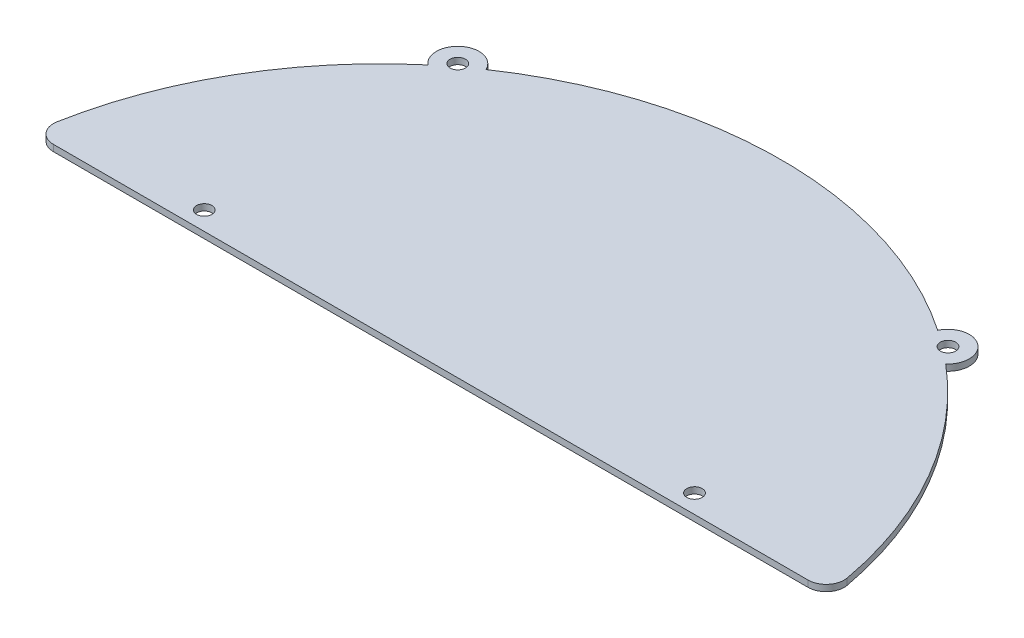
ISO-10303-21;
HEADER;
FILE_DESCRIPTION(('STEP AP214'),'2;1');
FILE_NAME('part.step','',(''),(''),'','','');
FILE_SCHEMA(('AUTOMOTIVE_DESIGN { 1 0 10303 214 1 1 1 1 }'));
ENDSEC;
DATA;
#1=APPLICATION_CONTEXT('core data for automotive mechanical design processes');
#2=APPLICATION_PROTOCOL_DEFINITION('international standard','automotive_design',2000,#1);
#3=PRODUCT_CONTEXT('',#1,'mechanical');
#4=PRODUCT('Part','Part','',(#3));
#5=PRODUCT_RELATED_PRODUCT_CATEGORY('part','',(#4));
#6=PRODUCT_DEFINITION_FORMATION('','',#4);
#7=PRODUCT_DEFINITION_CONTEXT('part definition',#1,'design');
#8=PRODUCT_DEFINITION('design','',#6,#7);
#9=PRODUCT_DEFINITION_SHAPE('','',#8);
#10=(LENGTH_UNIT() NAMED_UNIT(*) SI_UNIT(.MILLI.,.METRE.));
#11=(NAMED_UNIT(*) PLANE_ANGLE_UNIT() SI_UNIT($,.RADIAN.));
#12=(NAMED_UNIT(*) SI_UNIT($,.STERADIAN.) SOLID_ANGLE_UNIT());
#13=UNCERTAINTY_MEASURE_WITH_UNIT(LENGTH_MEASURE(1.E-05),#10,'distance_accuracy_value','');
#14=(GEOMETRIC_REPRESENTATION_CONTEXT(3) GLOBAL_UNCERTAINTY_ASSIGNED_CONTEXT((#13)) GLOBAL_UNIT_ASSIGNED_CONTEXT((#10,
#11,#12)) REPRESENTATION_CONTEXT('',''));
#15=CARTESIAN_POINT('',(0.,0.,0.));
#16=DIRECTION('',(0.,0.,1.));
#17=DIRECTION('',(1.,0.,0.));
#18=AXIS2_PLACEMENT_3D('',#15,#16,#17);
#19=CARTESIAN_POINT('',(0.,1.524,12.2093181818182));
#20=DIRECTION('',(0.,-1.,0.));
#21=DIRECTION('',(0.,0.,-1.));
#22=AXIS2_PLACEMENT_3D('',#19,#20,#21);
#23=CYLINDRICAL_SURFACE('',#22,96.0293181818182);
#24=DIRECTION('',(0.,1.,0.));
#25=VECTOR('',#24,1.);
#26=CARTESIAN_POINT('',(-61.9104185085003,-13.1762442863993,-61.1986516209711));
#27=LINE('',#26,#25);
#28=CARTESIAN_POINT('',(-61.9104185085003,0.,-61.1986516209711));
#29=VERTEX_POINT('',#28);
#30=CARTESIAN_POINT('',(-61.9104185085003,1.524,-61.1986516209711));
#31=VERTEX_POINT('',#30);
#32=EDGE_CURVE('E164',#29,#31,#27,.T.);
#33=ORIENTED_EDGE('',*,*,#32,.F.);
#34=CARTESIAN_POINT('',(0.,0.,12.2093181818182));
#35=DIRECTION('',(0.,-1.,0.));
#36=DIRECTION('',(0.,0.,-1.));
#37=AXIS2_PLACEMENT_3D('',#34,#35,#36);
#38=CIRCLE('',#37,96.0293181818182);
#39=CARTESIAN_POINT('',(-94.4571373578081,0.,-5.09614779379366));
#40=VERTEX_POINT('',#39);
#41=EDGE_CURVE('E138',#40,#29,#38,.T.);
#42=ORIENTED_EDGE('',*,*,#41,.F.);
#43=DIRECTION('',(0.,-1.,0.));
#44=VECTOR('',#43,1.);
#45=CARTESIAN_POINT('',(-94.457137357808,1.524,-5.09614779379366));
#46=LINE('',#45,#44);
#47=CARTESIAN_POINT('',(-94.4571373578081,1.524,-5.09614779379366));
#48=VERTEX_POINT('',#47);
#49=EDGE_CURVE('E193',#40,#48,#46,.F.);
#50=ORIENTED_EDGE('',*,*,#49,.T.);
#51=CARTESIAN_POINT('',(0.,1.524,12.2093181818182));
#52=DIRECTION('',(0.,-1.,0.));
#53=DIRECTION('',(0.,0.,-1.));
#54=AXIS2_PLACEMENT_3D('',#51,#52,#53);
#55=CIRCLE('',#54,96.0293181818182);
#56=EDGE_CURVE('E89',#48,#31,#55,.T.);
#57=ORIENTED_EDGE('',*,*,#56,.T.);
#58=EDGE_LOOP('',(#33,#42,#50,#57));
#59=FACE_BOUND('',#58,.T.);
#60=ADVANCED_FACE('F65',(#59),#23,.T.);
#61=DIRECTION('',(0.,1.,0.));
#62=VECTOR('',#61,1.);
#63=CARTESIAN_POINT('',(61.910418508501,-13.1762442863993,-61.1986516209705));
#64=LINE('',#63,#62);
#65=CARTESIAN_POINT('',(61.910418508501,0.,-61.1986516209705));
#66=VERTEX_POINT('',#65);
#67=CARTESIAN_POINT('',(61.910418508501,1.524,-61.1986516209705));
#68=VERTEX_POINT('',#67);
#69=EDGE_CURVE('E169',#66,#68,#64,.T.);
#70=ORIENTED_EDGE('',*,*,#69,.T.);
#71=CARTESIAN_POINT('',(94.4571373578081,1.524,-5.0961477937937));
#72=VERTEX_POINT('',#71);
#73=EDGE_CURVE('E190',#68,#72,#55,.T.);
#74=ORIENTED_EDGE('',*,*,#73,.T.);
#75=DIRECTION('',(0.,-1.,0.));
#76=VECTOR('',#75,1.);
#77=CARTESIAN_POINT('',(94.457137357808,1.524,-5.0961477937937));
#78=LINE('',#77,#76);
#79=CARTESIAN_POINT('',(94.4571373578081,0.,-5.0961477937937));
#80=VERTEX_POINT('',#79);
#81=EDGE_CURVE('E202',#72,#80,#78,.T.);
#82=ORIENTED_EDGE('',*,*,#81,.T.);
#83=EDGE_CURVE('E139',#66,#80,#38,.T.);
#84=ORIENTED_EDGE('',*,*,#83,.F.);
#85=EDGE_LOOP('',(#70,#74,#82,#84));
#86=FACE_BOUND('',#85,.T.);
#87=ADVANCED_FACE('F271',(#86),#23,.T.);
#88=DIRECTION('',(0.,1.,0.));
#89=VECTOR('',#88,1.);
#90=CARTESIAN_POINT('',(-53.9977264456855,-13.1762442863993,-67.2002246273543));
#91=LINE('',#90,#89);
#92=CARTESIAN_POINT('',(-53.9977264456855,0.,-67.2002246273543));
#93=VERTEX_POINT('',#92);
#94=CARTESIAN_POINT('',(-53.9977264456855,1.524,-67.2002246273543));
#95=VERTEX_POINT('',#94);
#96=EDGE_CURVE('E81',#93,#95,#91,.T.);
#97=ORIENTED_EDGE('',*,*,#96,.T.);
#98=CARTESIAN_POINT('',(53.9977264456855,1.524,-67.2002246273543));
#99=VERTEX_POINT('',#98);
#100=EDGE_CURVE('E189',#95,#99,#55,.T.);
#101=ORIENTED_EDGE('',*,*,#100,.T.);
#102=DIRECTION('',(0.,1.,0.));
#103=VECTOR('',#102,1.);
#104=CARTESIAN_POINT('',(53.9977264456855,-13.1762442863993,-67.2002246273543));
#105=LINE('',#104,#103);
#106=CARTESIAN_POINT('',(53.9977264456855,0.,-67.2002246273543));
#107=VERTEX_POINT('',#106);
#108=EDGE_CURVE('E132',#107,#99,#105,.T.);
#109=ORIENTED_EDGE('',*,*,#108,.F.);
#110=EDGE_CURVE('E129',#93,#107,#38,.T.);
#111=ORIENTED_EDGE('',*,*,#110,.F.);
#112=EDGE_LOOP('',(#97,#101,#109,#111));
#113=FACE_BOUND('',#112,.T.);
#114=ADVANCED_FACE('F130',(#113),#23,.T.);
#115=CARTESIAN_POINT('',(-95.25,1.524,0.));
#116=DIRECTION('',(0.,0.,-1.));
#117=DIRECTION('',(-1.,0.,0.));
#118=AXIS2_PLACEMENT_3D('',#115,#116,#117);
#119=PLANE('',#118);
#120=DIRECTION('',(1.,0.,0.));
#121=VECTOR('',#120,1.);
#122=CARTESIAN_POINT('',(-95.25,0.,0.));
#123=LINE('',#122,#121);
#124=CARTESIAN_POINT('',(-90.2098311513974,0.,0.));
#125=VERTEX_POINT('',#124);
#126=CARTESIAN_POINT('',(90.2098311513974,0.,0.));
#127=VERTEX_POINT('',#126);
#128=EDGE_CURVE('E196',#125,#127,#123,.T.);
#129=ORIENTED_EDGE('',*,*,#128,.T.);
#130=DIRECTION('',(0.,1.,0.));
#131=VECTOR('',#130,1.);
#132=CARTESIAN_POINT('',(90.2098311513974,1.524,0.));
#133=LINE('',#132,#131);
#134=CARTESIAN_POINT('',(90.2098311513974,1.524,0.));
#135=VERTEX_POINT('',#134);
#136=EDGE_CURVE('E216',#127,#135,#133,.T.);
#137=ORIENTED_EDGE('',*,*,#136,.T.);
#138=DIRECTION('',(1.,0.,0.));
#139=VECTOR('',#138,1.);
#140=CARTESIAN_POINT('',(-95.25,1.524,0.));
#141=LINE('',#140,#139);
#142=CARTESIAN_POINT('',(-90.2098311513974,1.524,0.));
#143=VERTEX_POINT('',#142);
#144=EDGE_CURVE('E188',#143,#135,#141,.T.);
#145=ORIENTED_EDGE('',*,*,#144,.F.);
#146=DIRECTION('',(0.,1.,0.));
#147=VECTOR('',#146,1.);
#148=CARTESIAN_POINT('',(-90.2098311513974,0.,0.));
#149=LINE('',#148,#147);
#150=EDGE_CURVE('E212',#143,#125,#149,.F.);
#151=ORIENTED_EDGE('',*,*,#150,.T.);
#152=EDGE_LOOP('',(#129,#137,#145,#151));
#153=FACE_BOUND('',#152,.T.);
#154=ADVANCED_FACE('F229',(#153),#119,.F.);
#155=CARTESIAN_POINT('',(0.,1.524,12.2093181818182));
#156=DIRECTION('',(0.,-1.,0.));
#157=DIRECTION('',(0.,0.,-1.));
#158=AXIS2_PLACEMENT_3D('',#155,#156,#157);
#159=PLANE('',#158);
#160=CARTESIAN_POINT('',(-58.6018453338815,1.524,-65.0534854109267));
#161=DIRECTION('',(0.,1.,0.));
#162=DIRECTION('',(0.,0.,-1.));
#163=AXIS2_PLACEMENT_3D('',#160,#161,#162);
#164=CIRCLE('',#163,1.84150000000023);
#165=CARTESIAN_POINT('',(-58.6018453338815,1.524,-63.2119854109265));
#166=VERTEX_POINT('',#165);
#167=EDGE_CURVE('E154',#166,#166,#164,.T.);
#168=ORIENTED_EDGE('',*,*,#167,.F.);
#169=EDGE_LOOP('',(#168));
#170=FACE_BOUND('',#169,.T.);
#171=CARTESIAN_POINT('',(58.6018453338815,1.524,-4.445));
#172=DIRECTION('',(0.,1.,0.));
#173=DIRECTION('',(0.,0.,1.));
#174=AXIS2_PLACEMENT_3D('',#171,#172,#173);
#175=CIRCLE('',#174,1.84149999999999);
#176=CARTESIAN_POINT('',(58.6018453338815,1.524,-2.60350000000001));
#177=VERTEX_POINT('',#176);
#178=EDGE_CURVE('E238',#177,#177,#175,.T.);
#179=ORIENTED_EDGE('',*,*,#178,.F.);
#180=EDGE_LOOP('',(#179));
#181=FACE_BOUND('',#180,.T.);
#182=CARTESIAN_POINT('',(-58.6018453338815,1.524,-4.44500000000006));
#183=DIRECTION('',(0.,1.,0.));
#184=DIRECTION('',(0.,0.,-1.));
#185=AXIS2_PLACEMENT_3D('',#182,#183,#184);
#186=CIRCLE('',#185,1.84149999999999);
#187=CARTESIAN_POINT('',(-58.6018453338815,1.524,-2.60350000000006));
#188=VERTEX_POINT('',#187);
#189=EDGE_CURVE('E239',#188,#188,#186,.T.);
#190=ORIENTED_EDGE('',*,*,#189,.F.);
#191=EDGE_LOOP('',(#190));
#192=FACE_BOUND('',#191,.T.);
#193=ORIENTED_EDGE('',*,*,#100,.F.);
#194=CARTESIAN_POINT('',(-58.6018453338815,1.524,-65.0534854109267));
#195=DIRECTION('',(0.,1.,0.));
#196=DIRECTION('',(0.,0.,1.));
#197=AXIS2_PLACEMENT_3D('',#194,#195,#196);
#198=CIRCLE('',#197,5.07999999999998);
#199=EDGE_CURVE('E147',#31,#95,#198,.F.);
#200=ORIENTED_EDGE('',*,*,#199,.F.);
#201=ORIENTED_EDGE('',*,*,#56,.F.);
#202=CARTESIAN_POINT('',(-90.2098311513974,1.524,-4.31799999999999));
#203=DIRECTION('',(0.,-1.,0.));
#204=DIRECTION('',(0.,0.,-1.));
#205=AXIS2_PLACEMENT_3D('',#202,#203,#204);
#206=CIRCLE('',#205,4.318);
#207=EDGE_CURVE('E74',#48,#143,#206,.F.);
#208=ORIENTED_EDGE('',*,*,#207,.T.);
#209=ORIENTED_EDGE('',*,*,#144,.T.);
#210=CARTESIAN_POINT('',(90.2098311513974,1.524,-4.31800000000003));
#211=DIRECTION('',(0.,-1.,0.));
#212=DIRECTION('',(0.,0.,-1.));
#213=AXIS2_PLACEMENT_3D('',#210,#211,#212);
#214=CIRCLE('',#213,4.318);
#215=EDGE_CURVE('E12',#135,#72,#214,.F.);
#216=ORIENTED_EDGE('',*,*,#215,.T.);
#217=ORIENTED_EDGE('',*,*,#73,.F.);
#218=CARTESIAN_POINT('',(58.6018453338815,1.524,-65.0534854109267));
#219=DIRECTION('',(0.,1.,0.));
#220=DIRECTION('',(0.,0.,1.));
#221=AXIS2_PLACEMENT_3D('',#218,#219,#220);
#222=CIRCLE('',#221,5.07999999999998);
#223=EDGE_CURVE('E170',#68,#99,#222,.T.);
#224=ORIENTED_EDGE('',*,*,#223,.T.);
#225=EDGE_LOOP('',(#193,#200,#201,#208,#209,#216,#217,#224));
#226=FACE_BOUND('',#225,.T.);
#227=CARTESIAN_POINT('',(58.6018453338815,1.524,-65.0534854109267));
#228=DIRECTION('',(0.,1.,0.));
#229=DIRECTION('',(0.,0.,1.));
#230=AXIS2_PLACEMENT_3D('',#227,#228,#229);
#231=CIRCLE('',#230,1.84149999999999);
#232=CARTESIAN_POINT('',(58.6018453338815,1.524,-63.2119854109267));
#233=VERTEX_POINT('',#232);
#234=EDGE_CURVE('E165',#233,#233,#231,.T.);
#235=ORIENTED_EDGE('',*,*,#234,.F.);
#236=EDGE_LOOP('',(#235));
#237=FACE_BOUND('',#236,.T.);
#238=ADVANCED_FACE('F222',(#170,#181,#192,#226,#237),#159,.F.);
#239=CARTESIAN_POINT('',(0.,0.,12.2093181818182));
#240=DIRECTION('',(0.,-1.,0.));
#241=DIRECTION('',(0.,0.,-1.));
#242=AXIS2_PLACEMENT_3D('',#239,#240,#241);
#243=PLANE('',#242);
#244=CARTESIAN_POINT('',(-58.6018453338815,0.,-65.0534854109267));
#245=DIRECTION('',(0.,1.,0.));
#246=DIRECTION('',(0.,0.,-1.));
#247=AXIS2_PLACEMENT_3D('',#244,#245,#246);
#248=CIRCLE('',#247,1.84150000000023);
#249=CARTESIAN_POINT('',(-58.6018453338815,0.,-63.2119854109265));
#250=VERTEX_POINT('',#249);
#251=EDGE_CURVE('E158',#250,#250,#248,.T.);
#252=ORIENTED_EDGE('',*,*,#251,.T.);
#253=EDGE_LOOP('',(#252));
#254=FACE_BOUND('',#253,.T.);
#255=CARTESIAN_POINT('',(58.6018453338815,0.,-4.445));
#256=DIRECTION('',(0.,1.,0.));
#257=DIRECTION('',(0.,0.,1.));
#258=AXIS2_PLACEMENT_3D('',#255,#256,#257);
#259=CIRCLE('',#258,1.84149999999999);
#260=CARTESIAN_POINT('',(58.6018453338815,0.,-2.60350000000001));
#261=VERTEX_POINT('',#260);
#262=EDGE_CURVE('E234',#261,#261,#259,.T.);
#263=ORIENTED_EDGE('',*,*,#262,.T.);
#264=EDGE_LOOP('',(#263));
#265=FACE_BOUND('',#264,.T.);
#266=CARTESIAN_POINT('',(-58.6018453338815,0.,-4.44500000000006));
#267=DIRECTION('',(0.,1.,0.));
#268=DIRECTION('',(0.,0.,-1.));
#269=AXIS2_PLACEMENT_3D('',#266,#267,#268);
#270=CIRCLE('',#269,1.84149999999999);
#271=CARTESIAN_POINT('',(-58.6018453338815,0.,-2.60350000000006));
#272=VERTEX_POINT('',#271);
#273=EDGE_CURVE('E246',#272,#272,#270,.T.);
#274=ORIENTED_EDGE('',*,*,#273,.T.);
#275=EDGE_LOOP('',(#274));
#276=FACE_BOUND('',#275,.T.);
#277=CARTESIAN_POINT('',(58.6018453338815,0.,-65.0534854109267));
#278=DIRECTION('',(0.,-1.,0.));
#279=DIRECTION('',(0.,0.,-1.));
#280=AXIS2_PLACEMENT_3D('',#277,#278,#279);
#281=CIRCLE('',#280,1.84149999999999);
#282=CARTESIAN_POINT('',(58.6018453338815,0.,-66.8949854109267));
#283=VERTEX_POINT('',#282);
#284=EDGE_CURVE('E175',#283,#283,#281,.F.);
#285=ORIENTED_EDGE('',*,*,#284,.T.);
#286=EDGE_LOOP('',(#285));
#287=FACE_BOUND('',#286,.T.);
#288=ORIENTED_EDGE('',*,*,#41,.T.);
#289=CARTESIAN_POINT('',(-58.6018453338815,0.,-65.0534854109267));
#290=DIRECTION('',(0.,-1.,0.));
#291=DIRECTION('',(0.,0.,-1.));
#292=AXIS2_PLACEMENT_3D('',#289,#290,#291);
#293=CIRCLE('',#292,5.07999999999998);
#294=EDGE_CURVE('E145',#29,#93,#293,.T.);
#295=ORIENTED_EDGE('',*,*,#294,.T.);
#296=ORIENTED_EDGE('',*,*,#110,.T.);
#297=CARTESIAN_POINT('',(58.6018453338815,0.,-65.0534854109267));
#298=DIRECTION('',(0.,-1.,0.));
#299=DIRECTION('',(0.,0.,-1.));
#300=AXIS2_PLACEMENT_3D('',#297,#298,#299);
#301=CIRCLE('',#300,5.07999999999998);
#302=EDGE_CURVE('E174',#66,#107,#301,.F.);
#303=ORIENTED_EDGE('',*,*,#302,.F.);
#304=ORIENTED_EDGE('',*,*,#83,.T.);
#305=CARTESIAN_POINT('',(90.2098311513974,0.,-4.31800000000003));
#306=DIRECTION('',(0.,-1.,0.));
#307=DIRECTION('',(0.,0.,-1.));
#308=AXIS2_PLACEMENT_3D('',#305,#306,#307);
#309=CIRCLE('',#308,4.318);
#310=EDGE_CURVE('E209',#80,#127,#309,.T.);
#311=ORIENTED_EDGE('',*,*,#310,.T.);
#312=ORIENTED_EDGE('',*,*,#128,.F.);
#313=CARTESIAN_POINT('',(-90.2098311513974,0.,-4.31799999999999));
#314=DIRECTION('',(0.,-1.,0.));
#315=DIRECTION('',(0.,0.,-1.));
#316=AXIS2_PLACEMENT_3D('',#313,#314,#315);
#317=CIRCLE('',#316,4.318);
#318=EDGE_CURVE('E206',#125,#40,#317,.T.);
#319=ORIENTED_EDGE('',*,*,#318,.T.);
#320=EDGE_LOOP('',(#288,#295,#296,#303,#304,#311,#312,#319));
#321=FACE_BOUND('',#320,.T.);
#322=ADVANCED_FACE('F151',(#254,#265,#276,#287,#321),#243,.T.);
#323=CARTESIAN_POINT('',(90.2098311513974,1.524,-4.31800000000003));
#324=DIRECTION('',(0.,-1.,0.));
#325=DIRECTION('',(0.,0.,-1.));
#326=AXIS2_PLACEMENT_3D('',#323,#324,#325);
#327=CYLINDRICAL_SURFACE('',#326,4.318);
#328=ORIENTED_EDGE('',*,*,#215,.F.);
#329=ORIENTED_EDGE('',*,*,#136,.F.);
#330=ORIENTED_EDGE('',*,*,#310,.F.);
#331=ORIENTED_EDGE('',*,*,#81,.F.);
#332=EDGE_LOOP('',(#328,#329,#330,#331));
#333=FACE_BOUND('',#332,.T.);
#334=ADVANCED_FACE('F263',(#333),#327,.T.);
#335=CARTESIAN_POINT('',(-90.2098311513974,1.524,-4.31799999999999));
#336=DIRECTION('',(0.,-1.,0.));
#337=DIRECTION('',(0.,0.,-1.));
#338=AXIS2_PLACEMENT_3D('',#335,#336,#337);
#339=CYLINDRICAL_SURFACE('',#338,4.318);
#340=ORIENTED_EDGE('',*,*,#207,.F.);
#341=ORIENTED_EDGE('',*,*,#49,.F.);
#342=ORIENTED_EDGE('',*,*,#318,.F.);
#343=ORIENTED_EDGE('',*,*,#150,.F.);
#344=EDGE_LOOP('',(#340,#341,#342,#343));
#345=FACE_BOUND('',#344,.T.);
#346=ADVANCED_FACE('F67',(#345),#339,.T.);
#347=CARTESIAN_POINT('',(58.6018453338815,-13.1762442863993,-65.0534854109267));
#348=DIRECTION('',(0.,1.,0.));
#349=DIRECTION('',(0.,0.,1.));
#350=AXIS2_PLACEMENT_3D('',#347,#348,#349);
#351=CYLINDRICAL_SURFACE('',#350,5.07999999999998);
#352=ORIENTED_EDGE('',*,*,#69,.F.);
#353=ORIENTED_EDGE('',*,*,#302,.T.);
#354=ORIENTED_EDGE('',*,*,#108,.T.);
#355=ORIENTED_EDGE('',*,*,#223,.F.);
#356=EDGE_LOOP('',(#352,#353,#354,#355));
#357=FACE_BOUND('',#356,.T.);
#358=ADVANCED_FACE('F307',(#357),#351,.T.);
#359=CARTESIAN_POINT('',(58.6018453338815,-13.1762442863993,-65.0534854109267));
#360=DIRECTION('',(0.,1.,0.));
#361=DIRECTION('',(0.,0.,1.));
#362=AXIS2_PLACEMENT_3D('',#359,#360,#361);
#363=CYLINDRICAL_SURFACE('',#362,1.84149999999999);
#364=ORIENTED_EDGE('',*,*,#234,.T.);
#365=EDGE_LOOP('',(#364));
#366=FACE_BOUND('',#365,.T.);
#367=ORIENTED_EDGE('',*,*,#284,.F.);
#368=EDGE_LOOP('',(#367));
#369=FACE_BOUND('',#368,.T.);
#370=ADVANCED_FACE('F368',(#366,#369),#363,.F.);
#371=CARTESIAN_POINT('',(-58.6018453338815,-13.1762442863993,-65.0534854109267));
#372=DIRECTION('',(0.,1.,0.));
#373=DIRECTION('',(0.,0.,1.));
#374=AXIS2_PLACEMENT_3D('',#371,#372,#373);
#375=CYLINDRICAL_SURFACE('',#374,5.07999999999998);
#376=ORIENTED_EDGE('',*,*,#294,.F.);
#377=ORIENTED_EDGE('',*,*,#32,.T.);
#378=ORIENTED_EDGE('',*,*,#199,.T.);
#379=ORIENTED_EDGE('',*,*,#96,.F.);
#380=EDGE_LOOP('',(#376,#377,#378,#379));
#381=FACE_BOUND('',#380,.T.);
#382=ADVANCED_FACE('F144',(#381),#375,.T.);
#383=CARTESIAN_POINT('',(-58.6018453338815,0.,-4.44500000000006));
#384=DIRECTION('',(0.,1.,0.));
#385=DIRECTION('',(0.,0.,1.));
#386=AXIS2_PLACEMENT_3D('',#383,#384,#385);
#387=CYLINDRICAL_SURFACE('',#386,1.84149999999999);
#388=CARTESIAN_POINT('',(-58.6018453338815,0.,-2.60350000000006));
#389=CARTESIAN_POINT('',(-58.6018453338815,0.015875,-2.60350000000006));
#390=CARTESIAN_POINT('',(-58.6018453338815,0.03175,-2.60350000000006));
#391=CARTESIAN_POINT('',(-58.6018453338815,0.0635,-2.60350000000006));
#392=CARTESIAN_POINT('',(-58.6018453338815,0.079375,-2.60350000000006));
#393=CARTESIAN_POINT('',(-58.6018453338815,0.111125,-2.60350000000006));
#394=CARTESIAN_POINT('',(-58.6018453338815,0.127,-2.60350000000006));
#395=CARTESIAN_POINT('',(-58.6018453338815,0.15875,-2.60350000000006));
#396=CARTESIAN_POINT('',(-58.6018453338815,0.174625,-2.60350000000006));
#397=CARTESIAN_POINT('',(-58.6018453338815,0.206375,-2.60350000000006));
#398=CARTESIAN_POINT('',(-58.6018453338815,0.22225,-2.60350000000006));
#399=CARTESIAN_POINT('',(-58.6018453338815,0.254,-2.60350000000006));
#400=CARTESIAN_POINT('',(-58.6018453338815,0.269875,-2.60350000000006));
#401=CARTESIAN_POINT('',(-58.6018453338815,0.301625,-2.60350000000006));
#402=CARTESIAN_POINT('',(-58.6018453338815,0.3175,-2.60350000000006));
#403=CARTESIAN_POINT('',(-58.6018453338815,0.34925,-2.60350000000006));
#404=CARTESIAN_POINT('',(-58.6018453338815,0.365125,-2.60350000000006));
#405=CARTESIAN_POINT('',(-58.6018453338815,0.396875,-2.60350000000006));
#406=CARTESIAN_POINT('',(-58.6018453338815,0.41275,-2.60350000000006));
#407=CARTESIAN_POINT('',(-58.6018453338815,0.4445,-2.60350000000006));
#408=CARTESIAN_POINT('',(-58.6018453338815,0.460375,-2.60350000000006));
#409=CARTESIAN_POINT('',(-58.6018453338815,0.492125,-2.60350000000006));
#410=CARTESIAN_POINT('',(-58.6018453338815,0.508,-2.60350000000006));
#411=CARTESIAN_POINT('',(-58.6018453338815,0.53975,-2.60350000000006));
#412=CARTESIAN_POINT('',(-58.6018453338815,0.555625,-2.60350000000006));
#413=CARTESIAN_POINT('',(-58.6018453338815,0.587375,-2.60350000000006));
#414=CARTESIAN_POINT('',(-58.6018453338815,0.60325,-2.60350000000006));
#415=CARTESIAN_POINT('',(-58.6018453338815,0.635,-2.60350000000006));
#416=CARTESIAN_POINT('',(-58.6018453338815,0.650875,-2.60350000000006));
#417=CARTESIAN_POINT('',(-58.6018453338815,0.682625,-2.60350000000006));
#418=CARTESIAN_POINT('',(-58.6018453338815,0.6985,-2.60350000000006));
#419=CARTESIAN_POINT('',(-58.6018453338815,0.73025,-2.60350000000006));
#420=CARTESIAN_POINT('',(-58.6018453338815,0.746125,-2.60350000000006));
#421=CARTESIAN_POINT('',(-58.6018453338815,0.777875,-2.60350000000006));
#422=CARTESIAN_POINT('',(-58.6018453338815,0.79375,-2.60350000000006));
#423=CARTESIAN_POINT('',(-58.6018453338815,0.8255,-2.60350000000006));
#424=CARTESIAN_POINT('',(-58.6018453338815,0.841375,-2.60350000000006));
#425=CARTESIAN_POINT('',(-58.6018453338815,0.873125,-2.60350000000006));
#426=CARTESIAN_POINT('',(-58.6018453338815,0.889,-2.60350000000006));
#427=CARTESIAN_POINT('',(-58.6018453338815,0.92075,-2.60350000000006));
#428=CARTESIAN_POINT('',(-58.6018453338815,0.936625,-2.60350000000006));
#429=CARTESIAN_POINT('',(-58.6018453338815,0.968375,-2.60350000000006));
#430=CARTESIAN_POINT('',(-58.6018453338815,0.98425,-2.60350000000006));
#431=CARTESIAN_POINT('',(-58.6018453338815,1.016,-2.60350000000006));
#432=CARTESIAN_POINT('',(-58.6018453338815,1.031875,-2.60350000000006));
#433=CARTESIAN_POINT('',(-58.6018453338815,1.063625,-2.60350000000006));
#434=CARTESIAN_POINT('',(-58.6018453338815,1.0795,-2.60350000000006));
#435=CARTESIAN_POINT('',(-58.6018453338815,1.11125,-2.60350000000006));
#436=CARTESIAN_POINT('',(-58.6018453338815,1.127125,-2.60350000000006));
#437=CARTESIAN_POINT('',(-58.6018453338815,1.158875,-2.60350000000006));
#438=CARTESIAN_POINT('',(-58.6018453338815,1.17475,-2.60350000000006));
#439=CARTESIAN_POINT('',(-58.6018453338815,1.2065,-2.60350000000006));
#440=CARTESIAN_POINT('',(-58.6018453338815,1.222375,-2.60350000000006));
#441=CARTESIAN_POINT('',(-58.6018453338815,1.254125,-2.60350000000006));
#442=CARTESIAN_POINT('',(-58.6018453338815,1.27,-2.60350000000006));
#443=CARTESIAN_POINT('',(-58.6018453338815,1.30175,-2.60350000000006));
#444=CARTESIAN_POINT('',(-58.6018453338815,1.317625,-2.60350000000006));
#445=CARTESIAN_POINT('',(-58.6018453338815,1.349375,-2.60350000000006));
#446=CARTESIAN_POINT('',(-58.6018453338815,1.36525,-2.60350000000006));
#447=CARTESIAN_POINT('',(-58.6018453338815,1.397,-2.60350000000006));
#448=CARTESIAN_POINT('',(-58.6018453338815,1.412875,-2.60350000000006));
#449=CARTESIAN_POINT('',(-58.6018453338815,1.444625,-2.60350000000006));
#450=CARTESIAN_POINT('',(-58.6018453338815,1.4605,-2.60350000000006));
#451=CARTESIAN_POINT('',(-58.6018453338815,1.49225,-2.60350000000006));
#452=CARTESIAN_POINT('',(-58.6018453338815,1.508125,-2.60350000000006));
#453=CARTESIAN_POINT('',(-58.6018453338815,1.524,-2.60350000000006));
#454=B_SPLINE_CURVE_WITH_KNOTS('',3,(#388,#389,#390,#391,#392,#393,#394,#395,#396,#397,#398,
#399,#400,#401,#402,#403,#404,#405,#406,#407,#408,#409,#410,#411,#412,#413,#414,#415,#416,#417,
#418,#419,#420,#421,#422,#423,#424,#425,#426,#427,#428,#429,#430,#431,#432,#433,#434,#435,#436,
#437,#438,#439,#440,#441,#442,#443,#444,#445,#446,#447,#448,#449,#450,#451,#452,#453),
.UNSPECIFIED.,.F.,.F.,(4,2,2,2,2,2,2,2,2,2,2,2,2,2,2,2,2,2,2,2,2,2,2,2,2,2,2,2,2,2,2,2,4),(0.,
0.047625,0.09525,0.142875,0.1905,0.238125,0.28575,0.333375,0.381,0.428625,0.47625,0.523875,
0.5715,0.619125,0.66675,0.714375,0.762,0.809625,0.85725,0.904875,0.9525,1.000125,1.04775,
1.095375,1.143,1.190625,1.23825,1.285875,1.3335,1.381125,1.42875,1.476375,1.524),.UNSPECIFIED.);
#455=EDGE_CURVE('BSEAM254',#272,#188,#454,.T.);
#456=ORIENTED_EDGE('',*,*,#273,.F.);
#457=ORIENTED_EDGE('',*,*,#189,.T.);
#458=ORIENTED_EDGE('',*,*,#455,.T.);
#459=ORIENTED_EDGE('',*,*,#455,.F.);
#460=EDGE_LOOP('',(#456,#458,#457,#459));
#461=FACE_BOUND('',#460,.T.);
#462=ADVANCED_FACE('F254',(#461),#387,.F.);
#463=CARTESIAN_POINT('',(58.6018453338815,0.,-4.445));
#464=DIRECTION('',(0.,1.,0.));
#465=DIRECTION('',(0.,0.,1.));
#466=AXIS2_PLACEMENT_3D('',#463,#464,#465);
#467=CYLINDRICAL_SURFACE('',#466,1.84149999999999);
#468=CARTESIAN_POINT('',(58.6018453338815,0.,-2.60350000000001));
#469=CARTESIAN_POINT('',(58.6018453338815,0.015875,-2.60350000000001));
#470=CARTESIAN_POINT('',(58.6018453338815,0.03175,-2.60350000000001));
#471=CARTESIAN_POINT('',(58.6018453338815,0.0635,-2.60350000000001));
#472=CARTESIAN_POINT('',(58.6018453338815,0.079375,-2.60350000000001));
#473=CARTESIAN_POINT('',(58.6018453338815,0.111125,-2.60350000000001));
#474=CARTESIAN_POINT('',(58.6018453338815,0.127,-2.60350000000001));
#475=CARTESIAN_POINT('',(58.6018453338815,0.15875,-2.60350000000001));
#476=CARTESIAN_POINT('',(58.6018453338815,0.174625,-2.60350000000001));
#477=CARTESIAN_POINT('',(58.6018453338815,0.206375,-2.60350000000001));
#478=CARTESIAN_POINT('',(58.6018453338815,0.22225,-2.60350000000001));
#479=CARTESIAN_POINT('',(58.6018453338815,0.254,-2.60350000000001));
#480=CARTESIAN_POINT('',(58.6018453338815,0.269875,-2.60350000000001));
#481=CARTESIAN_POINT('',(58.6018453338815,0.301625,-2.60350000000001));
#482=CARTESIAN_POINT('',(58.6018453338815,0.3175,-2.60350000000001));
#483=CARTESIAN_POINT('',(58.6018453338815,0.34925,-2.60350000000001));
#484=CARTESIAN_POINT('',(58.6018453338815,0.365125,-2.60350000000001));
#485=CARTESIAN_POINT('',(58.6018453338815,0.396875,-2.60350000000001));
#486=CARTESIAN_POINT('',(58.6018453338815,0.41275,-2.60350000000001));
#487=CARTESIAN_POINT('',(58.6018453338815,0.4445,-2.60350000000001));
#488=CARTESIAN_POINT('',(58.6018453338815,0.460375,-2.60350000000001));
#489=CARTESIAN_POINT('',(58.6018453338815,0.492125,-2.60350000000001));
#490=CARTESIAN_POINT('',(58.6018453338815,0.508,-2.60350000000001));
#491=CARTESIAN_POINT('',(58.6018453338815,0.53975,-2.60350000000001));
#492=CARTESIAN_POINT('',(58.6018453338815,0.555625,-2.60350000000001));
#493=CARTESIAN_POINT('',(58.6018453338815,0.587375,-2.60350000000001));
#494=CARTESIAN_POINT('',(58.6018453338815,0.60325,-2.60350000000001));
#495=CARTESIAN_POINT('',(58.6018453338815,0.635,-2.60350000000001));
#496=CARTESIAN_POINT('',(58.6018453338815,0.650875,-2.60350000000001));
#497=CARTESIAN_POINT('',(58.6018453338815,0.682625,-2.60350000000001));
#498=CARTESIAN_POINT('',(58.6018453338815,0.6985,-2.60350000000001));
#499=CARTESIAN_POINT('',(58.6018453338815,0.73025,-2.60350000000001));
#500=CARTESIAN_POINT('',(58.6018453338815,0.746125,-2.60350000000001));
#501=CARTESIAN_POINT('',(58.6018453338815,0.777875,-2.60350000000001));
#502=CARTESIAN_POINT('',(58.6018453338815,0.79375,-2.60350000000001));
#503=CARTESIAN_POINT('',(58.6018453338815,0.8255,-2.60350000000001));
#504=CARTESIAN_POINT('',(58.6018453338815,0.841375,-2.60350000000001));
#505=CARTESIAN_POINT('',(58.6018453338815,0.873125,-2.60350000000001));
#506=CARTESIAN_POINT('',(58.6018453338815,0.889,-2.60350000000001));
#507=CARTESIAN_POINT('',(58.6018453338815,0.92075,-2.60350000000001));
#508=CARTESIAN_POINT('',(58.6018453338815,0.936625,-2.60350000000001));
#509=CARTESIAN_POINT('',(58.6018453338815,0.968375,-2.60350000000001));
#510=CARTESIAN_POINT('',(58.6018453338815,0.98425,-2.60350000000001));
#511=CARTESIAN_POINT('',(58.6018453338815,1.016,-2.60350000000001));
#512=CARTESIAN_POINT('',(58.6018453338815,1.031875,-2.60350000000001));
#513=CARTESIAN_POINT('',(58.6018453338815,1.063625,-2.60350000000001));
#514=CARTESIAN_POINT('',(58.6018453338815,1.0795,-2.60350000000001));
#515=CARTESIAN_POINT('',(58.6018453338815,1.11125,-2.60350000000001));
#516=CARTESIAN_POINT('',(58.6018453338815,1.127125,-2.60350000000001));
#517=CARTESIAN_POINT('',(58.6018453338815,1.158875,-2.60350000000001));
#518=CARTESIAN_POINT('',(58.6018453338815,1.17475,-2.60350000000001));
#519=CARTESIAN_POINT('',(58.6018453338815,1.2065,-2.60350000000001));
#520=CARTESIAN_POINT('',(58.6018453338815,1.222375,-2.60350000000001));
#521=CARTESIAN_POINT('',(58.6018453338815,1.254125,-2.60350000000001));
#522=CARTESIAN_POINT('',(58.6018453338815,1.27,-2.60350000000001));
#523=CARTESIAN_POINT('',(58.6018453338815,1.30175,-2.60350000000001));
#524=CARTESIAN_POINT('',(58.6018453338815,1.317625,-2.60350000000001));
#525=CARTESIAN_POINT('',(58.6018453338815,1.349375,-2.60350000000001));
#526=CARTESIAN_POINT('',(58.6018453338815,1.36525,-2.60350000000001));
#527=CARTESIAN_POINT('',(58.6018453338815,1.397,-2.60350000000001));
#528=CARTESIAN_POINT('',(58.6018453338815,1.412875,-2.60350000000001));
#529=CARTESIAN_POINT('',(58.6018453338815,1.444625,-2.60350000000001));
#530=CARTESIAN_POINT('',(58.6018453338815,1.4605,-2.60350000000001));
#531=CARTESIAN_POINT('',(58.6018453338815,1.49225,-2.60350000000001));
#532=CARTESIAN_POINT('',(58.6018453338815,1.508125,-2.60350000000001));
#533=CARTESIAN_POINT('',(58.6018453338815,1.524,-2.60350000000001));
#534=B_SPLINE_CURVE_WITH_KNOTS('',3,(#468,#469,#470,#471,#472,#473,#474,#475,#476,#477,#478,
#479,#480,#481,#482,#483,#484,#485,#486,#487,#488,#489,#490,#491,#492,#493,#494,#495,#496,#497,
#498,#499,#500,#501,#502,#503,#504,#505,#506,#507,#508,#509,#510,#511,#512,#513,#514,#515,#516,
#517,#518,#519,#520,#521,#522,#523,#524,#525,#526,#527,#528,#529,#530,#531,#532,#533),
.UNSPECIFIED.,.F.,.F.,(4,2,2,2,2,2,2,2,2,2,2,2,2,2,2,2,2,2,2,2,2,2,2,2,2,2,2,2,2,2,2,2,4),(0.,
0.047625,0.09525,0.142875,0.1905,0.238125,0.28575,0.333375,0.381,0.428625,0.47625,0.523875,
0.5715,0.619125,0.66675,0.714375,0.762,0.809625,0.85725,0.904875,0.9525,1.000125,1.04775,
1.095375,1.143,1.190625,1.23825,1.285875,1.3335,1.381125,1.42875,1.476375,1.524),.UNSPECIFIED.);
#535=EDGE_CURVE('BSEAM401',#261,#177,#534,.T.);
#536=ORIENTED_EDGE('',*,*,#262,.F.);
#537=ORIENTED_EDGE('',*,*,#178,.T.);
#538=ORIENTED_EDGE('',*,*,#535,.T.);
#539=ORIENTED_EDGE('',*,*,#535,.F.);
#540=EDGE_LOOP('',(#536,#538,#537,#539));
#541=FACE_BOUND('',#540,.T.);
#542=ADVANCED_FACE('F401',(#541),#467,.F.);
#543=CARTESIAN_POINT('',(-58.6018453338815,0.,-65.0534854109267));
#544=DIRECTION('',(0.,1.,0.));
#545=DIRECTION('',(0.,0.,1.));
#546=AXIS2_PLACEMENT_3D('',#543,#544,#545);
#547=CYLINDRICAL_SURFACE('',#546,1.84150000000023);
#548=CARTESIAN_POINT('',(-58.6018453338815,0.,-63.2119854109265));
#549=CARTESIAN_POINT('',(-58.6018453338815,0.015875,-63.2119854109265));
#550=CARTESIAN_POINT('',(-58.6018453338815,0.03175,-63.2119854109265));
#551=CARTESIAN_POINT('',(-58.6018453338815,0.0635,-63.2119854109265));
#552=CARTESIAN_POINT('',(-58.6018453338815,0.079375,-63.2119854109265));
#553=CARTESIAN_POINT('',(-58.6018453338815,0.111125,-63.2119854109265));
#554=CARTESIAN_POINT('',(-58.6018453338815,0.127,-63.2119854109265));
#555=CARTESIAN_POINT('',(-58.6018453338815,0.15875,-63.2119854109265));
#556=CARTESIAN_POINT('',(-58.6018453338815,0.174625,-63.2119854109265));
#557=CARTESIAN_POINT('',(-58.6018453338815,0.206375,-63.2119854109265));
#558=CARTESIAN_POINT('',(-58.6018453338815,0.22225,-63.2119854109265));
#559=CARTESIAN_POINT('',(-58.6018453338815,0.254,-63.2119854109265));
#560=CARTESIAN_POINT('',(-58.6018453338815,0.269875,-63.2119854109265));
#561=CARTESIAN_POINT('',(-58.6018453338815,0.301625,-63.2119854109265));
#562=CARTESIAN_POINT('',(-58.6018453338815,0.3175,-63.2119854109265));
#563=CARTESIAN_POINT('',(-58.6018453338815,0.34925,-63.2119854109265));
#564=CARTESIAN_POINT('',(-58.6018453338815,0.365125,-63.2119854109265));
#565=CARTESIAN_POINT('',(-58.6018453338815,0.396875,-63.2119854109265));
#566=CARTESIAN_POINT('',(-58.6018453338815,0.41275,-63.2119854109265));
#567=CARTESIAN_POINT('',(-58.6018453338815,0.4445,-63.2119854109265));
#568=CARTESIAN_POINT('',(-58.6018453338815,0.460375,-63.2119854109265));
#569=CARTESIAN_POINT('',(-58.6018453338815,0.492125,-63.2119854109265));
#570=CARTESIAN_POINT('',(-58.6018453338815,0.508,-63.2119854109265));
#571=CARTESIAN_POINT('',(-58.6018453338815,0.53975,-63.2119854109265));
#572=CARTESIAN_POINT('',(-58.6018453338815,0.555625,-63.2119854109265));
#573=CARTESIAN_POINT('',(-58.6018453338815,0.587375,-63.2119854109265));
#574=CARTESIAN_POINT('',(-58.6018453338815,0.60325,-63.2119854109265));
#575=CARTESIAN_POINT('',(-58.6018453338815,0.635,-63.2119854109265));
#576=CARTESIAN_POINT('',(-58.6018453338815,0.650875,-63.2119854109265));
#577=CARTESIAN_POINT('',(-58.6018453338815,0.682625,-63.2119854109265));
#578=CARTESIAN_POINT('',(-58.6018453338815,0.6985,-63.2119854109265));
#579=CARTESIAN_POINT('',(-58.6018453338815,0.73025,-63.2119854109265));
#580=CARTESIAN_POINT('',(-58.6018453338815,0.746125,-63.2119854109265));
#581=CARTESIAN_POINT('',(-58.6018453338815,0.777875,-63.2119854109265));
#582=CARTESIAN_POINT('',(-58.6018453338815,0.79375,-63.2119854109265));
#583=CARTESIAN_POINT('',(-58.6018453338815,0.8255,-63.2119854109265));
#584=CARTESIAN_POINT('',(-58.6018453338815,0.841375,-63.2119854109265));
#585=CARTESIAN_POINT('',(-58.6018453338815,0.873125,-63.2119854109265));
#586=CARTESIAN_POINT('',(-58.6018453338815,0.889,-63.2119854109265));
#587=CARTESIAN_POINT('',(-58.6018453338815,0.92075,-63.2119854109265));
#588=CARTESIAN_POINT('',(-58.6018453338815,0.936625,-63.2119854109265));
#589=CARTESIAN_POINT('',(-58.6018453338815,0.968375,-63.2119854109265));
#590=CARTESIAN_POINT('',(-58.6018453338815,0.98425,-63.2119854109265));
#591=CARTESIAN_POINT('',(-58.6018453338815,1.016,-63.2119854109265));
#592=CARTESIAN_POINT('',(-58.6018453338815,1.031875,-63.2119854109265));
#593=CARTESIAN_POINT('',(-58.6018453338815,1.063625,-63.2119854109265));
#594=CARTESIAN_POINT('',(-58.6018453338815,1.0795,-63.2119854109265));
#595=CARTESIAN_POINT('',(-58.6018453338815,1.11125,-63.2119854109265));
#596=CARTESIAN_POINT('',(-58.6018453338815,1.127125,-63.2119854109265));
#597=CARTESIAN_POINT('',(-58.6018453338815,1.158875,-63.2119854109265));
#598=CARTESIAN_POINT('',(-58.6018453338815,1.17475,-63.2119854109265));
#599=CARTESIAN_POINT('',(-58.6018453338815,1.2065,-63.2119854109265));
#600=CARTESIAN_POINT('',(-58.6018453338815,1.222375,-63.2119854109265));
#601=CARTESIAN_POINT('',(-58.6018453338815,1.254125,-63.2119854109265));
#602=CARTESIAN_POINT('',(-58.6018453338815,1.27,-63.2119854109265));
#603=CARTESIAN_POINT('',(-58.6018453338815,1.30175,-63.2119854109265));
#604=CARTESIAN_POINT('',(-58.6018453338815,1.317625,-63.2119854109265));
#605=CARTESIAN_POINT('',(-58.6018453338815,1.349375,-63.2119854109265));
#606=CARTESIAN_POINT('',(-58.6018453338815,1.36525,-63.2119854109265));
#607=CARTESIAN_POINT('',(-58.6018453338815,1.397,-63.2119854109265));
#608=CARTESIAN_POINT('',(-58.6018453338815,1.412875,-63.2119854109265));
#609=CARTESIAN_POINT('',(-58.6018453338815,1.444625,-63.2119854109265));
#610=CARTESIAN_POINT('',(-58.6018453338815,1.4605,-63.2119854109265));
#611=CARTESIAN_POINT('',(-58.6018453338815,1.49225,-63.2119854109265));
#612=CARTESIAN_POINT('',(-58.6018453338815,1.508125,-63.2119854109265));
#613=CARTESIAN_POINT('',(-58.6018453338815,1.524,-63.2119854109265));
#614=B_SPLINE_CURVE_WITH_KNOTS('',3,(#548,#549,#550,#551,#552,#553,#554,#555,#556,#557,#558,
#559,#560,#561,#562,#563,#564,#565,#566,#567,#568,#569,#570,#571,#572,#573,#574,#575,#576,#577,
#578,#579,#580,#581,#582,#583,#584,#585,#586,#587,#588,#589,#590,#591,#592,#593,#594,#595,#596,
#597,#598,#599,#600,#601,#602,#603,#604,#605,#606,#607,#608,#609,#610,#611,#612,#613),
.UNSPECIFIED.,.F.,.F.,(4,2,2,2,2,2,2,2,2,2,2,2,2,2,2,2,2,2,2,2,2,2,2,2,2,2,2,2,2,2,2,2,4),(0.,
0.047625,0.09525,0.142875,0.1905,0.238125,0.28575,0.333375,0.381,0.428625,0.47625,0.523875,
0.5715,0.619125,0.66675,0.714375,0.762,0.809625,0.85725,0.904875,0.9525,1.000125,1.04775,
1.095375,1.143,1.190625,1.23825,1.285875,1.3335,1.381125,1.42875,1.476375,1.524),.UNSPECIFIED.);
#615=EDGE_CURVE('BSEAM408',#250,#166,#614,.T.);
#616=ORIENTED_EDGE('',*,*,#251,.F.);
#617=ORIENTED_EDGE('',*,*,#167,.T.);
#618=ORIENTED_EDGE('',*,*,#615,.T.);
#619=ORIENTED_EDGE('',*,*,#615,.F.);
#620=EDGE_LOOP('',(#616,#618,#617,#619));
#621=FACE_BOUND('',#620,.T.);
#622=ADVANCED_FACE('F408',(#621),#547,.F.);
#623=CLOSED_SHELL('',(#60,#87,#114,#154,#238,#322,#334,#346,#358,#370,#382,#462,#542,#622));
#624=MANIFOLD_SOLID_BREP('B2',#623);
#625=ADVANCED_BREP_SHAPE_REPRESENTATION('',(#18,#624),#14);
#626=SHAPE_DEFINITION_REPRESENTATION(#9,#625);
ENDSEC;
END-ISO-10303-21;
